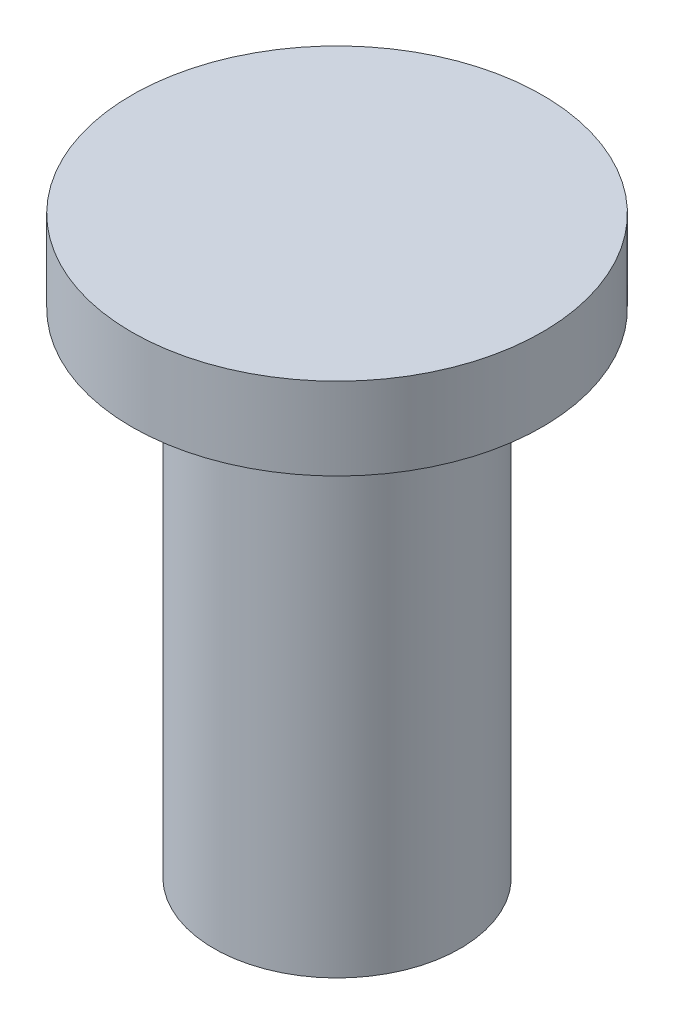
ISO-10303-21;
HEADER;
FILE_DESCRIPTION(('STEP AP214'),'2;1');
FILE_NAME('part.step','',(''),(''),'','','');
FILE_SCHEMA(('AUTOMOTIVE_DESIGN { 1 0 10303 214 1 1 1 1 }'));
ENDSEC;
DATA;
#1=APPLICATION_CONTEXT('core data for automotive mechanical design processes');
#2=APPLICATION_PROTOCOL_DEFINITION('international standard','automotive_design',2000,#1);
#3=PRODUCT_CONTEXT('',#1,'mechanical');
#4=PRODUCT('Part','Part','',(#3));
#5=PRODUCT_RELATED_PRODUCT_CATEGORY('part','',(#4));
#6=PRODUCT_DEFINITION_FORMATION('','',#4);
#7=PRODUCT_DEFINITION_CONTEXT('part definition',#1,'design');
#8=PRODUCT_DEFINITION('design','',#6,#7);
#9=PRODUCT_DEFINITION_SHAPE('','',#8);
#10=(LENGTH_UNIT() NAMED_UNIT(*) SI_UNIT(.MILLI.,.METRE.));
#11=(NAMED_UNIT(*) PLANE_ANGLE_UNIT() SI_UNIT($,.RADIAN.));
#12=(NAMED_UNIT(*) SI_UNIT($,.STERADIAN.) SOLID_ANGLE_UNIT());
#13=UNCERTAINTY_MEASURE_WITH_UNIT(LENGTH_MEASURE(1.E-05),#10,'distance_accuracy_value','');
#14=(GEOMETRIC_REPRESENTATION_CONTEXT(3) GLOBAL_UNCERTAINTY_ASSIGNED_CONTEXT((#13)) GLOBAL_UNIT_ASSIGNED_CONTEXT((#10,
#11,#12)) REPRESENTATION_CONTEXT('',''));
#15=CARTESIAN_POINT('',(0.,0.,0.));
#16=DIRECTION('',(0.,0.,1.));
#17=DIRECTION('',(1.,0.,0.));
#18=AXIS2_PLACEMENT_3D('',#15,#16,#17);
#19=CARTESIAN_POINT('',(0.,1.,0.));
#20=DIRECTION('',(0.,-1.,0.));
#21=DIRECTION('',(0.,0.,-1.));
#22=AXIS2_PLACEMENT_3D('',#19,#20,#21);
#23=CYLINDRICAL_SURFACE('',#22,2.5);
#24=CARTESIAN_POINT('',(0.,1.,0.));
#25=DIRECTION('',(0.,1.,0.));
#26=DIRECTION('',(0.,0.,1.));
#27=AXIS2_PLACEMENT_3D('',#24,#25,#26);
#28=CIRCLE('',#27,2.5);
#29=CARTESIAN_POINT('',(0.,1.,2.5));
#30=VERTEX_POINT('',#29);
#31=EDGE_CURVE('E46',#30,#30,#28,.T.);
#32=ORIENTED_EDGE('',*,*,#31,.F.);
#33=EDGE_LOOP('',(#32));
#34=FACE_BOUND('',#33,.T.);
#35=CARTESIAN_POINT('',(0.,0.,0.));
#36=DIRECTION('',(0.,1.,0.));
#37=DIRECTION('',(0.,0.,1.));
#38=AXIS2_PLACEMENT_3D('',#35,#36,#37);
#39=CIRCLE('',#38,2.5);
#40=CARTESIAN_POINT('',(0.,0.,2.5));
#41=VERTEX_POINT('',#40);
#42=EDGE_CURVE('E42',#41,#41,#39,.T.);
#43=ORIENTED_EDGE('',*,*,#42,.T.);
#44=EDGE_LOOP('',(#43));
#45=FACE_BOUND('',#44,.T.);
#46=ADVANCED_FACE('F39',(#34,#45),#23,.T.);
#47=CARTESIAN_POINT('',(0.,1.,0.));
#48=DIRECTION('',(0.,1.,0.));
#49=DIRECTION('',(0.,0.,1.));
#50=AXIS2_PLACEMENT_3D('',#47,#48,#49);
#51=PLANE('',#50);
#52=ORIENTED_EDGE('',*,*,#31,.T.);
#53=EDGE_LOOP('',(#52));
#54=FACE_BOUND('',#53,.T.);
#55=ADVANCED_FACE('F63',(#54),#51,.T.);
#56=CARTESIAN_POINT('',(0.,0.,0.));
#57=DIRECTION('',(0.,1.,0.));
#58=DIRECTION('',(0.,0.,1.));
#59=AXIS2_PLACEMENT_3D('',#56,#57,#58);
#60=PLANE('',#59);
#61=CARTESIAN_POINT('',(0.,0.,0.));
#62=DIRECTION('',(0.,-1.,0.));
#63=DIRECTION('',(0.,0.,-1.));
#64=AXIS2_PLACEMENT_3D('',#61,#62,#63);
#65=CIRCLE('',#64,1.5);
#66=CARTESIAN_POINT('',(0.,0.,-1.5));
#67=VERTEX_POINT('',#66);
#68=EDGE_CURVE('E10',#67,#67,#65,.T.);
#69=ORIENTED_EDGE('',*,*,#68,.F.);
#70=EDGE_LOOP('',(#69));
#71=FACE_BOUND('',#70,.T.);
#72=ORIENTED_EDGE('',*,*,#42,.F.);
#73=EDGE_LOOP('',(#72));
#74=FACE_BOUND('',#73,.T.);
#75=ADVANCED_FACE('F60',(#71,#74),#60,.F.);
#76=CARTESIAN_POINT('',(0.,-6.,0.));
#77=DIRECTION('',(0.,1.,0.));
#78=DIRECTION('',(0.,0.,1.));
#79=AXIS2_PLACEMENT_3D('',#76,#77,#78);
#80=CYLINDRICAL_SURFACE('',#79,1.5);
#81=CARTESIAN_POINT('',(0.,-6.,0.));
#82=DIRECTION('',(0.,-1.,0.));
#83=DIRECTION('',(0.,0.,-1.));
#84=AXIS2_PLACEMENT_3D('',#81,#82,#83);
#85=CIRCLE('',#84,1.5);
#86=CARTESIAN_POINT('',(0.,-6.,-1.5));
#87=VERTEX_POINT('',#86);
#88=EDGE_CURVE('E52',#87,#87,#85,.T.);
#89=ORIENTED_EDGE('',*,*,#88,.F.);
#90=EDGE_LOOP('',(#89));
#91=FACE_BOUND('',#90,.T.);
#92=ORIENTED_EDGE('',*,*,#68,.T.);
#93=EDGE_LOOP('',(#92));
#94=FACE_BOUND('',#93,.T.);
#95=ADVANCED_FACE('F62',(#91,#94),#80,.T.);
#96=CARTESIAN_POINT('',(0.,-6.,0.));
#97=DIRECTION('',(0.,-1.,0.));
#98=DIRECTION('',(0.,0.,-1.));
#99=AXIS2_PLACEMENT_3D('',#96,#97,#98);
#100=PLANE('',#99);
#101=ORIENTED_EDGE('',*,*,#88,.T.);
#102=EDGE_LOOP('',(#101));
#103=FACE_BOUND('',#102,.T.);
#104=ADVANCED_FACE('F69',(#103),#100,.T.);
#105=CLOSED_SHELL('',(#46,#55,#75,#95,#104));
#106=MANIFOLD_SOLID_BREP('B2',#105);
#107=ADVANCED_BREP_SHAPE_REPRESENTATION('',(#18,#106),#14);
#108=SHAPE_DEFINITION_REPRESENTATION(#9,#107);
ENDSEC;
END-ISO-10303-21;
